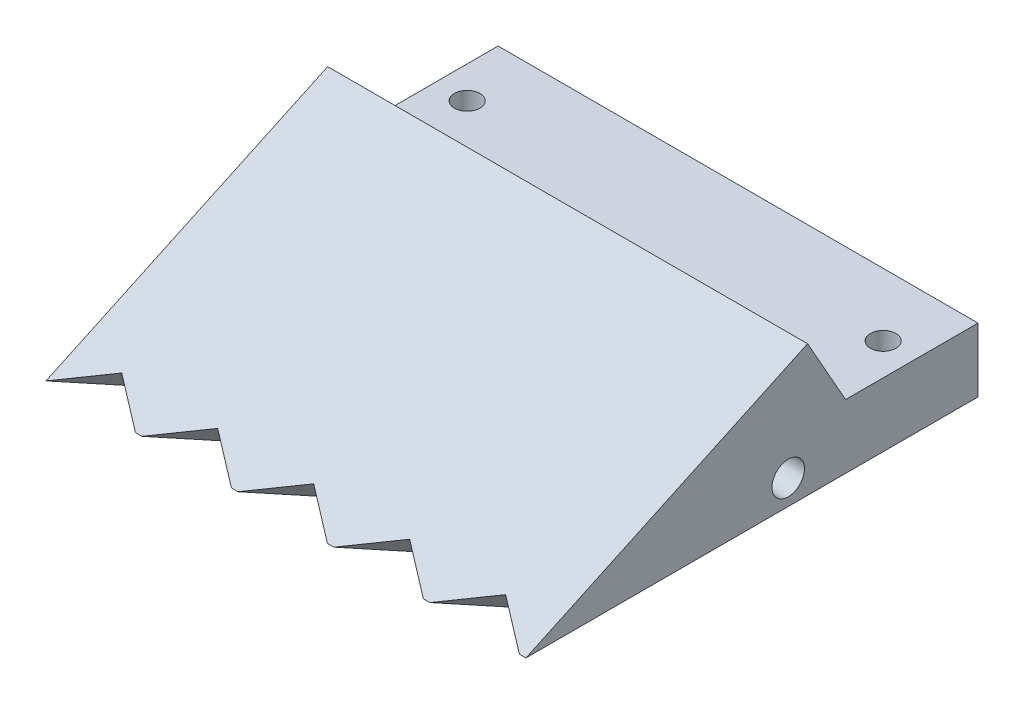
ISO-10303-21;
HEADER;
FILE_DESCRIPTION(('STEP AP214'),'2;1');
FILE_NAME('part.step','',(''),(''),'','','');
FILE_SCHEMA(('AUTOMOTIVE_DESIGN { 1 0 10303 214 1 1 1 1 }'));
ENDSEC;
DATA;
#1=APPLICATION_CONTEXT('core data for automotive mechanical design processes');
#2=APPLICATION_PROTOCOL_DEFINITION('international standard','automotive_design',2000,#1);
#3=PRODUCT_CONTEXT('',#1,'mechanical');
#4=PRODUCT('Part','Part','',(#3));
#5=PRODUCT_RELATED_PRODUCT_CATEGORY('part','',(#4));
#6=PRODUCT_DEFINITION_FORMATION('','',#4);
#7=PRODUCT_DEFINITION_CONTEXT('part definition',#1,'design');
#8=PRODUCT_DEFINITION('design','',#6,#7);
#9=PRODUCT_DEFINITION_SHAPE('','',#8);
#10=(LENGTH_UNIT() NAMED_UNIT(*) SI_UNIT(.MILLI.,.METRE.));
#11=(NAMED_UNIT(*) PLANE_ANGLE_UNIT() SI_UNIT($,.RADIAN.));
#12=(NAMED_UNIT(*) SI_UNIT($,.STERADIAN.) SOLID_ANGLE_UNIT());
#13=UNCERTAINTY_MEASURE_WITH_UNIT(LENGTH_MEASURE(1.E-05),#10,'distance_accuracy_value','');
#14=(GEOMETRIC_REPRESENTATION_CONTEXT(3) GLOBAL_UNCERTAINTY_ASSIGNED_CONTEXT((#13)) GLOBAL_UNIT_ASSIGNED_CONTEXT((#10,
#11,#12)) REPRESENTATION_CONTEXT('',''));
#15=CARTESIAN_POINT('',(0.,0.,0.));
#16=DIRECTION('',(0.,0.,1.));
#17=DIRECTION('',(1.,0.,0.));
#18=AXIS2_PLACEMENT_3D('',#15,#16,#17);
#19=CARTESIAN_POINT('',(75.,24.6994464564003,-8.57109619459907));
#20=DIRECTION('',(0.,-0.906307787036653,-0.422618261740694));
#21=DIRECTION('',(0.,0.422618261740694,-0.906307787036653));
#22=AXIS2_PLACEMENT_3D('',#19,#20,#21);
#23=PLANE('',#22);
#24=DIRECTION('',(0.,-0.422618261740694,0.906307787036653));
#25=VECTOR('',#24,1.);
#26=CARTESIAN_POINT('',(0.,24.6994464564003,-8.57109619459907));
#27=LINE('',#26,#25);
#28=CARTESIAN_POINT('',(0.,24.6994464564003,-8.57109619459907));
#29=VERTEX_POINT('',#28);
#30=CARTESIAN_POINT('',(0.,4.17318887122065,35.4476052489812));
#31=VERTEX_POINT('',#30);
#32=EDGE_CURVE('E245',#29,#31,#27,.T.);
#33=ORIENTED_EDGE('',*,*,#32,.T.);
#34=DIRECTION('',(-0.802159031205732,-0.25234978014748,0.541165849915346));
#35=VECTOR('',#34,1.);
#36=CARTESIAN_POINT('',(0.,4.17318887122065,35.4476052489812));
#37=LINE('',#36,#35);
#38=CARTESIAN_POINT('',(7.06585008190916,6.39602205686052,30.6807240992381));
#39=VERTEX_POINT('',#38);
#40=EDGE_CURVE('E159',#39,#31,#37,.T.);
#41=ORIENTED_EDGE('',*,*,#40,.F.);
#42=DIRECTION('',(-0.795744215045441,0.255951500653194,-0.548889764465591));
#43=VECTOR('',#42,1.);
#44=CARTESIAN_POINT('',(7.06585008190916,6.39602205686052,30.6807240992381));
#45=LINE('',#44,#43);
#46=CARTESIAN_POINT('',(13.9765602905617,4.17318887122065,35.4476052489812));
#47=VERTEX_POINT('',#46);
#48=EDGE_CURVE('E145',#47,#39,#45,.T.);
#49=ORIENTED_EDGE('',*,*,#48,.F.);
#50=DIRECTION('',(-1.,0.,0.));
#51=VECTOR('',#50,1.);
#52=CARTESIAN_POINT('',(75.,4.17318887122065,35.4476052489812));
#53=LINE('',#52,#51);
#54=CARTESIAN_POINT('',(15.,4.17318887122073,35.447605248981));
#55=VERTEX_POINT('',#54);
#56=EDGE_CURVE('E158',#55,#47,#53,.T.);
#57=ORIENTED_EDGE('',*,*,#56,.F.);
#58=DIRECTION('',(-0.802159031205732,-0.252349780147481,0.541165849915346));
#59=VECTOR('',#58,1.);
#60=CARTESIAN_POINT('',(15.,4.17318887122073,35.447605248981));
#61=LINE('',#60,#59);
#62=CARTESIAN_POINT('',(22.0658500819091,6.39602205686061,30.6807240992379));
#63=VERTEX_POINT('',#62);
#64=EDGE_CURVE('E428',#63,#55,#61,.T.);
#65=ORIENTED_EDGE('',*,*,#64,.F.);
#66=DIRECTION('',(-0.795744215045442,0.255951500653195,-0.548889764465591));
#67=VECTOR('',#66,1.);
#68=CARTESIAN_POINT('',(22.0658500819091,6.39602205686061,30.6807240992379));
#69=LINE('',#68,#67);
#70=CARTESIAN_POINT('',(28.9765602905617,4.17318887122073,35.447605248981));
#71=VERTEX_POINT('',#70);
#72=EDGE_CURVE('E223',#71,#63,#69,.T.);
#73=ORIENTED_EDGE('',*,*,#72,.F.);
#74=CARTESIAN_POINT('',(30.,4.17318887122082,35.4476052489808));
#75=VERTEX_POINT('',#74);
#76=EDGE_CURVE('E166',#75,#71,#53,.T.);
#77=ORIENTED_EDGE('',*,*,#76,.F.);
#78=DIRECTION('',(-0.802159031205732,-0.25234978014748,0.541165849915346));
#79=VECTOR('',#78,1.);
#80=CARTESIAN_POINT('',(30.,4.17318887122082,35.4476052489808));
#81=LINE('',#80,#79);
#82=CARTESIAN_POINT('',(37.0658500819091,6.3960220568607,30.6807240992377));
#83=VERTEX_POINT('',#82);
#84=EDGE_CURVE('E208',#83,#75,#81,.T.);
#85=ORIENTED_EDGE('',*,*,#84,.F.);
#86=DIRECTION('',(-0.795744215045442,0.255951500653194,-0.548889764465591));
#87=VECTOR('',#86,1.);
#88=CARTESIAN_POINT('',(37.0658500819091,6.3960220568607,30.6807240992377));
#89=LINE('',#88,#87);
#90=CARTESIAN_POINT('',(43.9765602905617,4.17318887122082,35.4476052489808));
#91=VERTEX_POINT('',#90);
#92=EDGE_CURVE('E206',#91,#83,#89,.T.);
#93=ORIENTED_EDGE('',*,*,#92,.F.);
#94=CARTESIAN_POINT('',(45.,4.17318887122091,35.4476052489806));
#95=VERTEX_POINT('',#94);
#96=EDGE_CURVE('E173',#95,#91,#53,.T.);
#97=ORIENTED_EDGE('',*,*,#96,.F.);
#98=DIRECTION('',(-0.802159031205732,-0.25234978014748,0.541165849915346));
#99=VECTOR('',#98,1.);
#100=CARTESIAN_POINT('',(45.,4.17318887122091,35.4476052489806));
#101=LINE('',#100,#99);
#102=CARTESIAN_POINT('',(52.0658500819091,6.39602205686078,30.6807240992375));
#103=VERTEX_POINT('',#102);
#104=EDGE_CURVE('E203',#103,#95,#101,.T.);
#105=ORIENTED_EDGE('',*,*,#104,.F.);
#106=DIRECTION('',(-0.795744215045442,0.255951500653194,-0.548889764465591));
#107=VECTOR('',#106,1.);
#108=CARTESIAN_POINT('',(52.0658500819091,6.39602205686078,30.6807240992375));
#109=LINE('',#108,#107);
#110=CARTESIAN_POINT('',(58.9765602905616,4.17318887122091,35.4476052489806));
#111=VERTEX_POINT('',#110);
#112=EDGE_CURVE('E224',#111,#103,#109,.T.);
#113=ORIENTED_EDGE('',*,*,#112,.F.);
#114=CARTESIAN_POINT('',(60.,4.173188871221,35.4476052489804));
#115=VERTEX_POINT('',#114);
#116=EDGE_CURVE('E181',#115,#111,#53,.T.);
#117=ORIENTED_EDGE('',*,*,#116,.F.);
#118=DIRECTION('',(-0.802159031205732,-0.25234978014748,0.541165849915346));
#119=VECTOR('',#118,1.);
#120=CARTESIAN_POINT('',(60.,4.173188871221,35.4476052489804));
#121=LINE('',#120,#119);
#122=CARTESIAN_POINT('',(67.0658500819091,6.39602205686087,30.6807240992373));
#123=VERTEX_POINT('',#122);
#124=EDGE_CURVE('E235',#123,#115,#121,.T.);
#125=ORIENTED_EDGE('',*,*,#124,.F.);
#126=DIRECTION('',(-0.795744215045442,0.255951500653194,-0.548889764465591));
#127=VECTOR('',#126,1.);
#128=CARTESIAN_POINT('',(67.0658500819091,6.39602205686087,30.6807240992373));
#129=LINE('',#128,#127);
#130=CARTESIAN_POINT('',(73.9765602905616,4.173188871221,35.4476052489804));
#131=VERTEX_POINT('',#130);
#132=EDGE_CURVE('E231',#131,#123,#129,.T.);
#133=ORIENTED_EDGE('',*,*,#132,.F.);
#134=CARTESIAN_POINT('',(75.,4.17318887122065,35.4476052489812));
#135=VERTEX_POINT('',#134);
#136=EDGE_CURVE('E169',#135,#131,#53,.T.);
#137=ORIENTED_EDGE('',*,*,#136,.F.);
#138=DIRECTION('',(0.,-0.422618261740694,0.906307787036653));
#139=VECTOR('',#138,1.);
#140=CARTESIAN_POINT('',(75.,24.6994464564003,-8.57109619459907));
#141=LINE('',#140,#139);
#142=CARTESIAN_POINT('',(75.,24.6994464564003,-8.57109619459907));
#143=VERTEX_POINT('',#142);
#144=EDGE_CURVE('E250',#143,#135,#141,.T.);
#145=ORIENTED_EDGE('',*,*,#144,.F.);
#146=DIRECTION('',(-1.,0.,0.));
#147=VECTOR('',#146,1.);
#148=CARTESIAN_POINT('',(75.,24.6994464564003,-8.57109619459907));
#149=LINE('',#148,#147);
#150=EDGE_CURVE('E267',#143,#29,#149,.T.);
#151=ORIENTED_EDGE('',*,*,#150,.T.);
#152=EDGE_LOOP('',(#33,#41,#49,#57,#65,#73,#77,#85,#93,#97,#105,#113,#117,#125,#133,#137,#145,#151));
#153=FACE_BOUND('',#152,.T.);
#154=ADVANCED_FACE('F39',(#153),#23,.F.);
#155=CARTESIAN_POINT('',(75.,4.17318887122065,35.4476052489812));
#156=DIRECTION('',(0.,1.,0.));
#157=DIRECTION('',(0.,0.,1.));
#158=AXIS2_PLACEMENT_3D('',#155,#156,#157);
#159=PLANE('',#158);
#160=CARTESIAN_POINT('',(69.9999989548679,4.17318887122065,-25.3862154796132));
#161=DIRECTION('',(0.,1.,0.));
#162=DIRECTION('',(0.,0.,1.));
#163=AXIS2_PLACEMENT_3D('',#160,#161,#162);
#164=CIRCLE('',#163,3.99999999999999);
#165=CARTESIAN_POINT('',(69.9999989548679,4.17318887122065,-21.3862154796132));
#166=VERTEX_POINT('',#165);
#167=EDGE_CURVE('E320',#166,#166,#164,.T.);
#168=ORIENTED_EDGE('',*,*,#167,.T.);
#169=EDGE_LOOP('',(#168));
#170=FACE_BOUND('',#169,.T.);
#171=CARTESIAN_POINT('',(5.,4.17318887122065,-25.3745592722076));
#172=DIRECTION('',(0.,1.,0.));
#173=DIRECTION('',(0.,0.,1.));
#174=AXIS2_PLACEMENT_3D('',#171,#172,#173);
#175=CIRCLE('',#174,3.99999999999999);
#176=CARTESIAN_POINT('',(5.,4.17318887122065,-21.3745592722076));
#177=VERTEX_POINT('',#176);
#178=EDGE_CURVE('E316',#177,#177,#175,.T.);
#179=ORIENTED_EDGE('',*,*,#178,.T.);
#180=EDGE_LOOP('',(#179));
#181=FACE_BOUND('',#180,.T.);
#182=DIRECTION('',(-0.765791701632656,0.,-0.643088695057347));
#183=VECTOR('',#182,1.);
#184=CARTESIAN_POINT('',(49.7629589494673,4.17318887122065,65.4999398006517));
#185=LINE('',#184,#183);
#186=CARTESIAN_POINT('',(7.06585008190916,4.17318887122065,29.6441999619731));
#187=VERTEX_POINT('',#186);
#188=EDGE_CURVE('E142',#47,#187,#185,.T.);
#189=ORIENTED_EDGE('',*,*,#188,.T.);
#190=DIRECTION('',(-0.772763043523777,0.,0.634694634106724));
#191=VECTOR('',#190,1.);
#192=CARTESIAN_POINT('',(44.7872041077098,4.17318887122065,-1.33753653805802));
#193=LINE('',#192,#191);
#194=EDGE_CURVE('E151',#187,#31,#193,.T.);
#195=ORIENTED_EDGE('',*,*,#194,.T.);
#196=DIRECTION('',(0.,0.,-1.));
#197=VECTOR('',#196,1.);
#198=CARTESIAN_POINT('',(0.,4.17318887122065,35.4476052489812));
#199=LINE('',#198,#197);
#200=CARTESIAN_POINT('',(0.,4.17318887122065,-35.2064814814815));
#201=VERTEX_POINT('',#200);
#202=EDGE_CURVE('E270',#31,#201,#199,.T.);
#203=ORIENTED_EDGE('',*,*,#202,.T.);
#204=DIRECTION('',(-1.,0.,0.));
#205=VECTOR('',#204,1.);
#206=CARTESIAN_POINT('',(75.,4.17318887122065,-35.2064814814815));
#207=LINE('',#206,#205);
#208=CARTESIAN_POINT('',(75.,4.17318887122065,-35.2064814814815));
#209=VERTEX_POINT('',#208);
#210=EDGE_CURVE('E167',#209,#201,#207,.T.);
#211=ORIENTED_EDGE('',*,*,#210,.F.);
#212=DIRECTION('',(0.,0.,-1.));
#213=VECTOR('',#212,1.);
#214=CARTESIAN_POINT('',(75.,4.17318887122065,35.4476052489812));
#215=LINE('',#214,#213);
#216=EDGE_CURVE('E254',#135,#209,#215,.T.);
#217=ORIENTED_EDGE('',*,*,#216,.F.);
#218=ORIENTED_EDGE('',*,*,#136,.T.);
#219=DIRECTION('',(-0.765791701632656,0.,-0.643088695057347));
#220=VECTOR('',#219,1.);
#221=CARTESIAN_POINT('',(74.5767431321014,4.17318887122065,35.9516206353298));
#222=LINE('',#221,#220);
#223=CARTESIAN_POINT('',(67.0658500819091,4.17318887122065,29.6441999619722));
#224=VERTEX_POINT('',#223);
#225=EDGE_CURVE('E180',#131,#224,#222,.T.);
#226=ORIENTED_EDGE('',*,*,#225,.T.);
#227=DIRECTION('',(-0.772763043523777,0.,0.634694634106724));
#228=VECTOR('',#227,1.);
#229=CARTESIAN_POINT('',(68.9574408215415,4.17318887122065,28.0905768915728));
#230=LINE('',#229,#228);
#231=EDGE_CURVE('E186',#224,#115,#230,.T.);
#232=ORIENTED_EDGE('',*,*,#231,.T.);
#233=ORIENTED_EDGE('',*,*,#116,.T.);
#234=DIRECTION('',(-0.765791701632656,0.,-0.643088695057347));
#235=VECTOR('',#234,1.);
#236=CARTESIAN_POINT('',(68.3732970864429,4.17318887122065,43.3387004266603));
#237=LINE('',#236,#235);
#238=CARTESIAN_POINT('',(52.0658500819091,4.17318887122065,29.6441999619725));
#239=VERTEX_POINT('',#238);
#240=EDGE_CURVE('E445',#111,#239,#237,.T.);
#241=ORIENTED_EDGE('',*,*,#240,.T.);
#242=DIRECTION('',(-0.772763043523777,0.,0.634694634106724));
#243=VECTOR('',#242,1.);
#244=CARTESIAN_POINT('',(62.9148816430836,4.17318887122065,20.7335485341651));
#245=LINE('',#244,#243);
#246=EDGE_CURVE('E199',#239,#95,#245,.T.);
#247=ORIENTED_EDGE('',*,*,#246,.T.);
#248=ORIENTED_EDGE('',*,*,#96,.T.);
#249=DIRECTION('',(-0.765791701632656,0.,-0.643088695057347));
#250=VECTOR('',#249,1.);
#251=CARTESIAN_POINT('',(62.1698510407844,4.17318887122065,50.7257802179907));
#252=LINE('',#251,#250);
#253=CARTESIAN_POINT('',(37.0658500819091,4.17318887122065,29.6441999619727));
#254=VERTEX_POINT('',#253);
#255=EDGE_CURVE('E197',#91,#254,#252,.T.);
#256=ORIENTED_EDGE('',*,*,#255,.T.);
#257=DIRECTION('',(-0.772763043523777,0.,0.634694634106724));
#258=VECTOR('',#257,1.);
#259=CARTESIAN_POINT('',(56.8723224646257,4.17318887122065,13.3765201767574));
#260=LINE('',#259,#258);
#261=EDGE_CURVE('E434',#254,#75,#260,.T.);
#262=ORIENTED_EDGE('',*,*,#261,.T.);
#263=ORIENTED_EDGE('',*,*,#76,.T.);
#264=DIRECTION('',(-0.765791701632656,0.,-0.643088695057347));
#265=VECTOR('',#264,1.);
#266=CARTESIAN_POINT('',(55.9664049951259,4.17318887122065,58.1128600093212));
#267=LINE('',#266,#265);
#268=CARTESIAN_POINT('',(22.0658500819091,4.17318887122065,29.6441999619729));
#269=VERTEX_POINT('',#268);
#270=EDGE_CURVE('E432',#71,#269,#267,.T.);
#271=ORIENTED_EDGE('',*,*,#270,.T.);
#272=DIRECTION('',(-0.772763043523778,0.,0.634694634106724));
#273=VECTOR('',#272,1.);
#274=CARTESIAN_POINT('',(50.8297632861678,4.17318887122065,6.01949181934968));
#275=LINE('',#274,#273);
#276=EDGE_CURVE('E152',#269,#55,#275,.T.);
#277=ORIENTED_EDGE('',*,*,#276,.T.);
#278=ORIENTED_EDGE('',*,*,#56,.T.);
#279=EDGE_LOOP('',(#189,#195,#203,#211,#217,#218,#226,#232,#233,#241,#247,#248,#256,#262,#263,
#271,#277,#278));
#280=FACE_BOUND('',#279,.T.);
#281=ADVANCED_FACE('F163',(#170,#181,#280),#159,.F.);
#282=CARTESIAN_POINT('',(75.,4.17318887122065,-35.2064814814815));
#283=DIRECTION('',(0.,0.,1.));
#284=DIRECTION('',(1.,0.,0.));
#285=AXIS2_PLACEMENT_3D('',#282,#283,#284);
#286=PLANE('',#285);
#287=DIRECTION('',(0.,1.,0.));
#288=VECTOR('',#287,1.);
#289=CARTESIAN_POINT('',(0.,4.17318887122065,-35.2064814814815));
#290=LINE('',#289,#288);
#291=CARTESIAN_POINT('',(0.,14.1731888712206,-35.2064814814815));
#292=VERTEX_POINT('',#291);
#293=EDGE_CURVE('E273',#201,#292,#290,.T.);
#294=ORIENTED_EDGE('',*,*,#293,.T.);
#295=DIRECTION('',(-1.,0.,0.));
#296=VECTOR('',#295,1.);
#297=CARTESIAN_POINT('',(75.,14.1731888712206,-35.2064814814815));
#298=LINE('',#297,#296);
#299=CARTESIAN_POINT('',(75.,14.1731888712206,-35.2064814814815));
#300=VERTEX_POINT('',#299);
#301=EDGE_CURVE('E175',#300,#292,#298,.T.);
#302=ORIENTED_EDGE('',*,*,#301,.F.);
#303=DIRECTION('',(0.,1.,0.));
#304=VECTOR('',#303,1.);
#305=CARTESIAN_POINT('',(75.,4.17318887122065,-35.2064814814815));
#306=LINE('',#305,#304);
#307=EDGE_CURVE('E258',#209,#300,#306,.T.);
#308=ORIENTED_EDGE('',*,*,#307,.F.);
#309=ORIENTED_EDGE('',*,*,#210,.T.);
#310=EDGE_LOOP('',(#294,#302,#308,#309));
#311=FACE_BOUND('',#310,.T.);
#312=ADVANCED_FACE('F313',(#311),#286,.F.);
#313=CARTESIAN_POINT('',(75.,14.1731888712206,-35.2064814814815));
#314=DIRECTION('',(0.,-1.,0.));
#315=DIRECTION('',(0.,0.,-1.));
#316=AXIS2_PLACEMENT_3D('',#313,#314,#315);
#317=PLANE('',#316);
#318=CARTESIAN_POINT('',(5.,14.1731888712206,-25.3745592722076));
#319=DIRECTION('',(0.,1.,0.));
#320=DIRECTION('',(0.,0.,1.));
#321=AXIS2_PLACEMENT_3D('',#318,#319,#320);
#322=CIRCLE('',#321,2.);
#323=CARTESIAN_POINT('',(5.,14.1731888712206,-23.3745592722076));
#324=VERTEX_POINT('',#323);
#325=EDGE_CURVE('E241',#324,#324,#322,.T.);
#326=ORIENTED_EDGE('',*,*,#325,.F.);
#327=EDGE_LOOP('',(#326));
#328=FACE_BOUND('',#327,.T.);
#329=CARTESIAN_POINT('',(69.9999989548679,14.1731888712206,-25.3862154796132));
#330=DIRECTION('',(0.,1.,0.));
#331=DIRECTION('',(0.,0.,1.));
#332=AXIS2_PLACEMENT_3D('',#329,#330,#331);
#333=CIRCLE('',#332,2.);
#334=CARTESIAN_POINT('',(69.9999989548679,14.1731888712206,-23.3862154796132));
#335=VERTEX_POINT('',#334);
#336=EDGE_CURVE('E246',#335,#335,#333,.T.);
#337=ORIENTED_EDGE('',*,*,#336,.F.);
#338=EDGE_LOOP('',(#337));
#339=FACE_BOUND('',#338,.T.);
#340=DIRECTION('',(0.,0.,1.));
#341=VECTOR('',#340,1.);
#342=CARTESIAN_POINT('',(0.,14.1731888712206,-35.2064814814815));
#343=LINE('',#342,#341);
#344=CARTESIAN_POINT('',(0.,14.1731888712206,-14.5119108644451));
#345=VERTEX_POINT('',#344);
#346=EDGE_CURVE('E276',#292,#345,#343,.T.);
#347=ORIENTED_EDGE('',*,*,#346,.T.);
#348=DIRECTION('',(-1.,0.,0.));
#349=VECTOR('',#348,1.);
#350=CARTESIAN_POINT('',(75.,14.1731888712206,-14.5119108644451));
#351=LINE('',#350,#349);
#352=CARTESIAN_POINT('',(75.,14.1731888712206,-14.5119108644451));
#353=VERTEX_POINT('',#352);
#354=EDGE_CURVE('E284',#353,#345,#351,.T.);
#355=ORIENTED_EDGE('',*,*,#354,.F.);
#356=DIRECTION('',(0.,0.,1.));
#357=VECTOR('',#356,1.);
#358=CARTESIAN_POINT('',(75.,14.1731888712206,-35.2064814814815));
#359=LINE('',#358,#357);
#360=EDGE_CURVE('E261',#300,#353,#359,.T.);
#361=ORIENTED_EDGE('',*,*,#360,.F.);
#362=ORIENTED_EDGE('',*,*,#301,.T.);
#363=EDGE_LOOP('',(#347,#355,#361,#362));
#364=FACE_BOUND('',#363,.T.);
#365=ADVANCED_FACE('F294',(#328,#339,#364),#317,.F.);
#366=CARTESIAN_POINT('',(75.,14.1731888712206,-14.5119108644451));
#367=DIRECTION('',(0.,-0.491504803469351,0.870874863666735));
#368=DIRECTION('',(0.,-0.870874863666736,-0.491504803469351));
#369=AXIS2_PLACEMENT_3D('',#366,#367,#368);
#370=PLANE('',#369);
#371=DIRECTION('',(0.,0.870874863666735,0.491504803469351));
#372=VECTOR('',#371,1.);
#373=CARTESIAN_POINT('',(0.,14.1731888712206,-14.5119108644451));
#374=LINE('',#373,#372);
#375=EDGE_CURVE('E255',#345,#29,#374,.T.);
#376=ORIENTED_EDGE('',*,*,#375,.T.);
#377=ORIENTED_EDGE('',*,*,#150,.F.);
#378=DIRECTION('',(0.,0.870874863666735,0.491504803469351));
#379=VECTOR('',#378,1.);
#380=CARTESIAN_POINT('',(75.,14.1731888712206,-14.5119108644451));
#381=LINE('',#380,#379);
#382=EDGE_CURVE('E264',#353,#143,#381,.T.);
#383=ORIENTED_EDGE('',*,*,#382,.F.);
#384=ORIENTED_EDGE('',*,*,#354,.T.);
#385=EDGE_LOOP('',(#376,#377,#383,#384));
#386=FACE_BOUND('',#385,.T.);
#387=ADVANCED_FACE('F306',(#386),#370,.F.);
#388=CARTESIAN_POINT('',(75.,0.,0.));
#389=DIRECTION('',(-1.,0.,0.));
#390=DIRECTION('',(0.,0.,1.));
#391=AXIS2_PLACEMENT_3D('',#388,#389,#390);
#392=PLANE('',#391);
#393=CARTESIAN_POINT('',(75.,8.033515634858,-5.54758710562415));
#394=DIRECTION('',(-1.,0.,0.));
#395=DIRECTION('',(0.,0.,1.));
#396=AXIS2_PLACEMENT_3D('',#393,#394,#395);
#397=CIRCLE('',#396,2.54300844368567);
#398=CARTESIAN_POINT('',(75.,8.033515634858,-3.00457866193848));
#399=VERTEX_POINT('',#398);
#400=EDGE_CURVE('E236',#399,#399,#397,.T.);
#401=ORIENTED_EDGE('',*,*,#400,.T.);
#402=EDGE_LOOP('',(#401));
#403=FACE_BOUND('',#402,.T.);
#404=ORIENTED_EDGE('',*,*,#144,.T.);
#405=ORIENTED_EDGE('',*,*,#216,.T.);
#406=ORIENTED_EDGE('',*,*,#307,.T.);
#407=ORIENTED_EDGE('',*,*,#360,.T.);
#408=ORIENTED_EDGE('',*,*,#382,.T.);
#409=EDGE_LOOP('',(#404,#405,#406,#407,#408));
#410=FACE_BOUND('',#409,.T.);
#411=ADVANCED_FACE('F311',(#403,#410),#392,.F.);
#412=CARTESIAN_POINT('',(0.,0.,0.));
#413=DIRECTION('',(-1.,0.,0.));
#414=DIRECTION('',(0.,0.,1.));
#415=AXIS2_PLACEMENT_3D('',#412,#413,#414);
#416=PLANE('',#415);
#417=CARTESIAN_POINT('',(0.,8.033515634858,-5.54758710562415));
#418=DIRECTION('',(-1.,0.,0.));
#419=DIRECTION('',(0.,0.,1.));
#420=AXIS2_PLACEMENT_3D('',#417,#418,#419);
#421=CIRCLE('',#420,2.54300844368567);
#422=CARTESIAN_POINT('',(0.,8.033515634858,-3.00457866193848));
#423=VERTEX_POINT('',#422);
#424=EDGE_CURVE('E415',#423,#423,#421,.T.);
#425=ORIENTED_EDGE('',*,*,#424,.F.);
#426=EDGE_LOOP('',(#425));
#427=FACE_BOUND('',#426,.T.);
#428=ORIENTED_EDGE('',*,*,#32,.F.);
#429=ORIENTED_EDGE('',*,*,#375,.F.);
#430=ORIENTED_EDGE('',*,*,#346,.F.);
#431=ORIENTED_EDGE('',*,*,#293,.F.);
#432=ORIENTED_EDGE('',*,*,#202,.F.);
#433=EDGE_LOOP('',(#428,#429,#430,#431,#432));
#434=FACE_BOUND('',#433,.T.);
#435=ADVANCED_FACE('F302',(#427,#434),#416,.T.);
#436=CARTESIAN_POINT('',(69.9999989548679,4.17318887122064,-25.3862154796132));
#437=DIRECTION('',(0.,1.,0.));
#438=DIRECTION('',(0.,0.,1.));
#439=AXIS2_PLACEMENT_3D('',#436,#437,#438);
#440=CYLINDRICAL_SURFACE('',#439,2.);
#441=CARTESIAN_POINT('',(69.9999989548679,6.17318887122064,-25.3862154796132));
#442=DIRECTION('',(0.,1.,0.));
#443=DIRECTION('',(0.,0.,1.));
#444=AXIS2_PLACEMENT_3D('',#441,#442,#443);
#445=CIRCLE('',#444,2.);
#446=CARTESIAN_POINT('',(69.9999989548679,6.17318887122064,-23.3862154796132));
#447=VERTEX_POINT('',#446);
#448=EDGE_CURVE('E48',#447,#447,#445,.F.);
#449=ORIENTED_EDGE('',*,*,#448,.T.);
#450=EDGE_LOOP('',(#449));
#451=FACE_BOUND('',#450,.T.);
#452=ORIENTED_EDGE('',*,*,#336,.T.);
#453=EDGE_LOOP('',(#452));
#454=FACE_BOUND('',#453,.T.);
#455=ADVANCED_FACE('F330',(#451,#454),#440,.F.);
#456=CARTESIAN_POINT('',(5.,4.17318887122064,-25.3745592722076));
#457=DIRECTION('',(0.,1.,0.));
#458=DIRECTION('',(0.,0.,1.));
#459=AXIS2_PLACEMENT_3D('',#456,#457,#458);
#460=CYLINDRICAL_SURFACE('',#459,2.);
#461=CARTESIAN_POINT('',(5.,6.17318887122064,-25.3745592722076));
#462=DIRECTION('',(0.,1.,0.));
#463=DIRECTION('',(0.,0.,1.));
#464=AXIS2_PLACEMENT_3D('',#461,#462,#463);
#465=CIRCLE('',#464,2.);
#466=CARTESIAN_POINT('',(5.,6.17318887122064,-23.3745592722076));
#467=VERTEX_POINT('',#466);
#468=EDGE_CURVE('E11',#467,#467,#465,.F.);
#469=ORIENTED_EDGE('',*,*,#468,.T.);
#470=EDGE_LOOP('',(#469));
#471=FACE_BOUND('',#470,.T.);
#472=ORIENTED_EDGE('',*,*,#325,.T.);
#473=EDGE_LOOP('',(#472));
#474=FACE_BOUND('',#473,.T.);
#475=ADVANCED_FACE('F369',(#471,#474),#460,.F.);
#476=CARTESIAN_POINT('',(60.,-4.88988899914553,31.2214226315735));
#477=DIRECTION('',(-0.597110449293161,0.339007055407765,-0.727002976423532));
#478=DIRECTION('',(-0.772763043523777,0.,0.634694634106724));
#479=AXIS2_PLACEMENT_3D('',#476,#477,#478);
#480=PLANE('',#479);
#481=DIRECTION('',(0.,0.906307787036653,0.422618261740694));
#482=VECTOR('',#481,1.);
#483=CARTESIAN_POINT('',(67.0658500819091,-2.66705581350565,26.4545414818304));
#484=LINE('',#483,#482);
#485=EDGE_CURVE('E228',#224,#123,#484,.T.);
#486=ORIENTED_EDGE('',*,*,#485,.T.);
#487=ORIENTED_EDGE('',*,*,#124,.T.);
#488=ORIENTED_EDGE('',*,*,#231,.F.);
#489=EDGE_LOOP('',(#486,#487,#488));
#490=FACE_BOUND('',#489,.T.);
#491=ADVANCED_FACE('F372',(#490),#480,.F.);
#492=CARTESIAN_POINT('',(67.0658500819091,-2.66705581350565,26.4545414818304));
#493=DIRECTION('',(0.605632846055854,0.336296036952717,-0.721189178585052));
#494=DIRECTION('',(-0.765791701632656,0.,-0.643088695057347));
#495=AXIS2_PLACEMENT_3D('',#492,#493,#494);
#496=PLANE('',#495);
#497=ORIENTED_EDGE('',*,*,#132,.T.);
#498=ORIENTED_EDGE('',*,*,#485,.F.);
#499=ORIENTED_EDGE('',*,*,#225,.F.);
#500=EDGE_LOOP('',(#497,#498,#499));
#501=FACE_BOUND('',#500,.T.);
#502=ADVANCED_FACE('F374',(#501),#496,.F.);
#503=CARTESIAN_POINT('',(45.,-4.88988899914562,31.2214226315737));
#504=DIRECTION('',(-0.597110449293161,0.339007055407765,-0.727002976423532));
#505=DIRECTION('',(-0.772763043523777,0.,0.634694634106724));
#506=AXIS2_PLACEMENT_3D('',#503,#504,#505);
#507=PLANE('',#506);
#508=DIRECTION('',(0.,0.906307787036653,0.422618261740694));
#509=VECTOR('',#508,1.);
#510=CARTESIAN_POINT('',(52.0658500819091,-2.66705581350574,26.4545414818306));
#511=LINE('',#510,#509);
#512=EDGE_CURVE('E211',#239,#103,#511,.T.);
#513=ORIENTED_EDGE('',*,*,#512,.T.);
#514=ORIENTED_EDGE('',*,*,#104,.T.);
#515=ORIENTED_EDGE('',*,*,#246,.F.);
#516=EDGE_LOOP('',(#513,#514,#515));
#517=FACE_BOUND('',#516,.T.);
#518=ADVANCED_FACE('F377',(#517),#507,.F.);
#519=CARTESIAN_POINT('',(52.0658500819091,-2.66705581350574,26.4545414818306));
#520=DIRECTION('',(0.605632846055854,0.336296036952717,-0.721189178585052));
#521=DIRECTION('',(-0.765791701632656,0.,-0.643088695057347));
#522=AXIS2_PLACEMENT_3D('',#519,#520,#521);
#523=PLANE('',#522);
#524=ORIENTED_EDGE('',*,*,#112,.T.);
#525=ORIENTED_EDGE('',*,*,#512,.F.);
#526=ORIENTED_EDGE('',*,*,#240,.F.);
#527=EDGE_LOOP('',(#524,#525,#526));
#528=FACE_BOUND('',#527,.T.);
#529=ADVANCED_FACE('F382',(#528),#523,.F.);
#530=CARTESIAN_POINT('',(30.,-4.88988899914571,31.2214226315739));
#531=DIRECTION('',(-0.597110449293161,0.339007055407765,-0.727002976423532));
#532=DIRECTION('',(-0.772763043523777,0.,0.634694634106724));
#533=AXIS2_PLACEMENT_3D('',#530,#531,#532);
#534=PLANE('',#533);
#535=DIRECTION('',(0.,0.906307787036653,0.422618261740694));
#536=VECTOR('',#535,1.);
#537=CARTESIAN_POINT('',(37.0658500819091,-2.66705581350583,26.4545414818308));
#538=LINE('',#537,#536);
#539=EDGE_CURVE('E215',#254,#83,#538,.T.);
#540=ORIENTED_EDGE('',*,*,#539,.T.);
#541=ORIENTED_EDGE('',*,*,#84,.T.);
#542=ORIENTED_EDGE('',*,*,#261,.F.);
#543=EDGE_LOOP('',(#540,#541,#542));
#544=FACE_BOUND('',#543,.T.);
#545=ADVANCED_FACE('F385',(#544),#534,.F.);
#546=CARTESIAN_POINT('',(37.0658500819091,-2.66705581350583,26.4545414818308));
#547=DIRECTION('',(0.605632846055854,0.336296036952717,-0.721189178585052));
#548=DIRECTION('',(-0.765791701632656,0.,-0.643088695057347));
#549=AXIS2_PLACEMENT_3D('',#546,#547,#548);
#550=PLANE('',#549);
#551=ORIENTED_EDGE('',*,*,#92,.T.);
#552=ORIENTED_EDGE('',*,*,#539,.F.);
#553=ORIENTED_EDGE('',*,*,#255,.F.);
#554=EDGE_LOOP('',(#551,#552,#553));
#555=FACE_BOUND('',#554,.T.);
#556=ADVANCED_FACE('F390',(#555),#550,.F.);
#557=CARTESIAN_POINT('',(15.,-4.8898889991458,31.221422631574));
#558=DIRECTION('',(-0.597110449293161,0.339007055407766,-0.727002976423533));
#559=DIRECTION('',(-0.772763043523778,0.,0.634694634106724));
#560=AXIS2_PLACEMENT_3D('',#557,#558,#559);
#561=PLANE('',#560);
#562=DIRECTION('',(0.,0.906307787036653,0.422618261740694));
#563=VECTOR('',#562,1.);
#564=CARTESIAN_POINT('',(22.0658500819091,-2.66705581350592,26.454541481831));
#565=LINE('',#564,#563);
#566=EDGE_CURVE('E63',#269,#63,#565,.T.);
#567=ORIENTED_EDGE('',*,*,#566,.T.);
#568=ORIENTED_EDGE('',*,*,#64,.T.);
#569=ORIENTED_EDGE('',*,*,#276,.F.);
#570=EDGE_LOOP('',(#567,#568,#569));
#571=FACE_BOUND('',#570,.T.);
#572=ADVANCED_FACE('F393',(#571),#561,.F.);
#573=CARTESIAN_POINT('',(22.0658500819091,-2.66705581350592,26.454541481831));
#574=DIRECTION('',(0.605632846055854,0.336296036952717,-0.721189178585052));
#575=DIRECTION('',(-0.765791701632656,0.,-0.643088695057347));
#576=AXIS2_PLACEMENT_3D('',#573,#574,#575);
#577=PLANE('',#576);
#578=ORIENTED_EDGE('',*,*,#72,.T.);
#579=ORIENTED_EDGE('',*,*,#566,.F.);
#580=ORIENTED_EDGE('',*,*,#270,.F.);
#581=EDGE_LOOP('',(#578,#579,#580));
#582=FACE_BOUND('',#581,.T.);
#583=ADVANCED_FACE('F397',(#582),#577,.F.);
#584=CARTESIAN_POINT('',(0.,-4.88988899914588,31.2214226315742));
#585=DIRECTION('',(-0.597110449293161,0.339007055407765,-0.727002976423532));
#586=DIRECTION('',(-0.772763043523777,0.,0.634694634106724));
#587=AXIS2_PLACEMENT_3D('',#584,#585,#586);
#588=PLANE('',#587);
#589=DIRECTION('',(0.,0.906307787036653,0.422618261740694));
#590=VECTOR('',#589,1.);
#591=CARTESIAN_POINT('',(7.06585008190916,-2.66705581350601,26.4545414818311));
#592=LINE('',#591,#590);
#593=EDGE_CURVE('E55',#187,#39,#592,.T.);
#594=ORIENTED_EDGE('',*,*,#593,.T.);
#595=ORIENTED_EDGE('',*,*,#40,.T.);
#596=ORIENTED_EDGE('',*,*,#194,.F.);
#597=EDGE_LOOP('',(#594,#595,#596));
#598=FACE_BOUND('',#597,.T.);
#599=ADVANCED_FACE('F400',(#598),#588,.F.);
#600=CARTESIAN_POINT('',(7.06585008190916,-2.66705581350601,26.4545414818311));
#601=DIRECTION('',(0.605632846055855,0.336296036952717,-0.721189178585052));
#602=DIRECTION('',(-0.765791701632656,0.,-0.643088695057347));
#603=AXIS2_PLACEMENT_3D('',#600,#601,#602);
#604=PLANE('',#603);
#605=ORIENTED_EDGE('',*,*,#48,.T.);
#606=ORIENTED_EDGE('',*,*,#593,.F.);
#607=ORIENTED_EDGE('',*,*,#188,.F.);
#608=EDGE_LOOP('',(#605,#606,#607));
#609=FACE_BOUND('',#608,.T.);
#610=ADVANCED_FACE('F144',(#609),#604,.F.);
#611=CARTESIAN_POINT('',(100.,8.033515634858,-5.54758710562415));
#612=DIRECTION('',(-1.,0.,0.));
#613=DIRECTION('',(0.,0.,1.));
#614=AXIS2_PLACEMENT_3D('',#611,#612,#613);
#615=CYLINDRICAL_SURFACE('',#614,2.54300844368567);
#616=ORIENTED_EDGE('',*,*,#424,.T.);
#617=EDGE_LOOP('',(#616));
#618=FACE_BOUND('',#617,.T.);
#619=ORIENTED_EDGE('',*,*,#400,.F.);
#620=EDGE_LOOP('',(#619));
#621=FACE_BOUND('',#620,.T.);
#622=ADVANCED_FACE('F336',(#618,#621),#615,.F.);
#623=CARTESIAN_POINT('',(69.9999989548679,4.17318887122065,-25.3862154796132));
#624=DIRECTION('',(0.,-1.,0.));
#625=DIRECTION('',(0.,0.,-1.));
#626=AXIS2_PLACEMENT_3D('',#623,#624,#625);
#627=CONICAL_SURFACE('',#626,3.99999999999999,0.785398163397447);
#628=ORIENTED_EDGE('',*,*,#448,.F.);
#629=EDGE_LOOP('',(#628));
#630=FACE_BOUND('',#629,.T.);
#631=ORIENTED_EDGE('',*,*,#167,.F.);
#632=EDGE_LOOP('',(#631));
#633=FACE_BOUND('',#632,.T.);
#634=ADVANCED_FACE('F333',(#630,#633),#627,.F.);
#635=CARTESIAN_POINT('',(5.,4.17318887122065,-25.3745592722076));
#636=DIRECTION('',(0.,-1.,0.));
#637=DIRECTION('',(0.,0.,-1.));
#638=AXIS2_PLACEMENT_3D('',#635,#636,#637);
#639=CONICAL_SURFACE('',#638,3.99999999999999,0.785398163397447);
#640=ORIENTED_EDGE('',*,*,#468,.F.);
#641=EDGE_LOOP('',(#640));
#642=FACE_BOUND('',#641,.T.);
#643=ORIENTED_EDGE('',*,*,#178,.F.);
#644=EDGE_LOOP('',(#643));
#645=FACE_BOUND('',#644,.T.);
#646=ADVANCED_FACE('F41',(#642,#645),#639,.F.);
#647=CLOSED_SHELL('',(#154,#281,#312,#365,#387,#411,#435,#455,#475,#491,#502,#518,#529,#545,
#556,#572,#583,#599,#610,#622,#634,#646));
#648=MANIFOLD_SOLID_BREP('B2',#647);
#649=ADVANCED_BREP_SHAPE_REPRESENTATION('',(#18,#648),#14);
#650=SHAPE_DEFINITION_REPRESENTATION(#9,#649);
ENDSEC;
END-ISO-10303-21;
